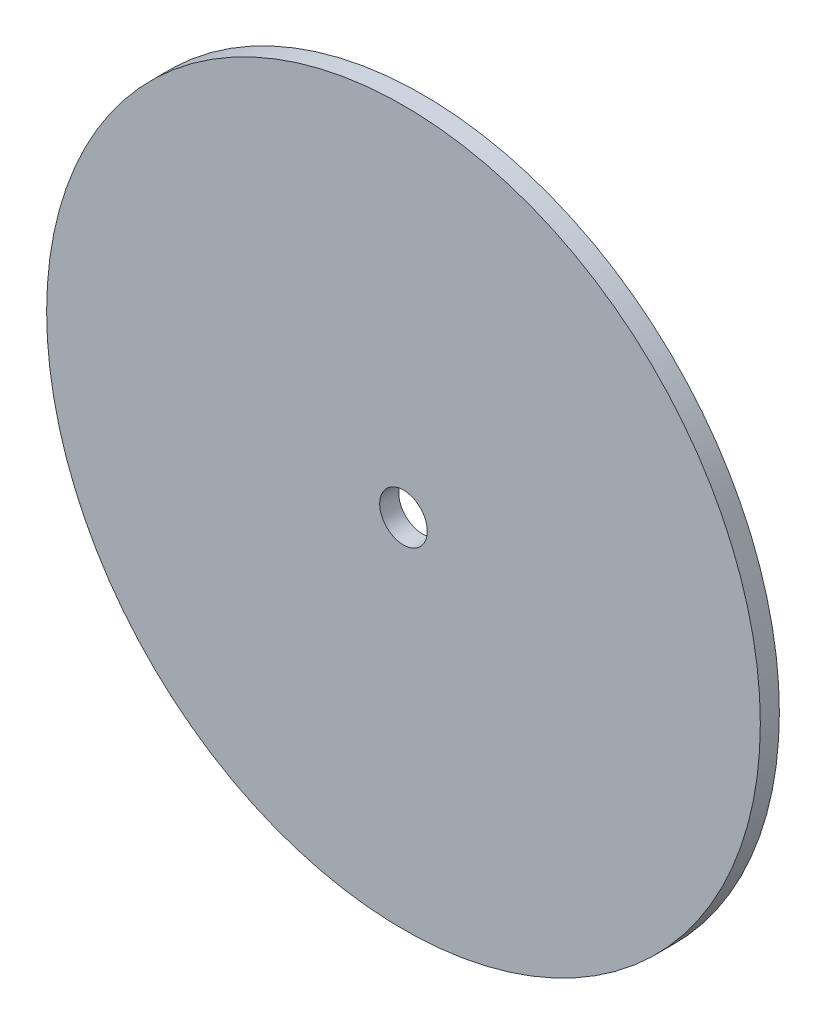
ISO-10303-21;
HEADER;
FILE_DESCRIPTION(('STEP AP214'),'2;1');
FILE_NAME('part.step','',(''),(''),'','','');
FILE_SCHEMA(('AUTOMOTIVE_DESIGN { 1 0 10303 214 1 1 1 1 }'));
ENDSEC;
DATA;
#1=APPLICATION_CONTEXT('core data for automotive mechanical design processes');
#2=APPLICATION_PROTOCOL_DEFINITION('international standard','automotive_design',2000,#1);
#3=PRODUCT_CONTEXT('',#1,'mechanical');
#4=PRODUCT('Part','Part','',(#3));
#5=PRODUCT_RELATED_PRODUCT_CATEGORY('part','',(#4));
#6=PRODUCT_DEFINITION_FORMATION('','',#4);
#7=PRODUCT_DEFINITION_CONTEXT('part definition',#1,'design');
#8=PRODUCT_DEFINITION('design','',#6,#7);
#9=PRODUCT_DEFINITION_SHAPE('','',#8);
#10=(LENGTH_UNIT() NAMED_UNIT(*) SI_UNIT(.MILLI.,.METRE.));
#11=(NAMED_UNIT(*) PLANE_ANGLE_UNIT() SI_UNIT($,.RADIAN.));
#12=(NAMED_UNIT(*) SI_UNIT($,.STERADIAN.) SOLID_ANGLE_UNIT());
#13=UNCERTAINTY_MEASURE_WITH_UNIT(LENGTH_MEASURE(1.E-05),#10,'distance_accuracy_value','');
#14=(GEOMETRIC_REPRESENTATION_CONTEXT(3) GLOBAL_UNCERTAINTY_ASSIGNED_CONTEXT((#13)) GLOBAL_UNIT_ASSIGNED_CONTEXT((#10,
#11,#12)) REPRESENTATION_CONTEXT('',''));
#15=CARTESIAN_POINT('',(0.,0.,0.));
#16=DIRECTION('',(0.,0.,1.));
#17=DIRECTION('',(1.,0.,0.));
#18=AXIS2_PLACEMENT_3D('',#15,#16,#17);
#19=CARTESIAN_POINT('',(0.,0.,-2.));
#20=DIRECTION('',(0.,0.,1.));
#21=DIRECTION('',(1.,0.,0.));
#22=AXIS2_PLACEMENT_3D('',#19,#20,#21);
#23=CYLINDRICAL_SURFACE('',#22,37.5);
#24=CARTESIAN_POINT('',(0.,0.,-2.));
#25=DIRECTION('',(0.,0.,1.));
#26=DIRECTION('',(1.,0.,0.));
#27=AXIS2_PLACEMENT_3D('',#24,#25,#26);
#28=CIRCLE('',#27,37.5);
#29=CARTESIAN_POINT('',(37.5,0.,-2.));
#30=VERTEX_POINT('',#29);
#31=EDGE_CURVE('E10',#30,#30,#28,.T.);
#32=ORIENTED_EDGE('',*,*,#31,.T.);
#33=EDGE_LOOP('',(#32));
#34=FACE_BOUND('',#33,.T.);
#35=CARTESIAN_POINT('',(0.,0.,0.));
#36=DIRECTION('',(0.,0.,1.));
#37=DIRECTION('',(1.,0.,0.));
#38=AXIS2_PLACEMENT_3D('',#35,#36,#37);
#39=CIRCLE('',#38,37.5);
#40=CARTESIAN_POINT('',(37.5,0.,0.));
#41=VERTEX_POINT('',#40);
#42=EDGE_CURVE('E38',#41,#41,#39,.T.);
#43=ORIENTED_EDGE('',*,*,#42,.F.);
#44=EDGE_LOOP('',(#43));
#45=FACE_BOUND('',#44,.T.);
#46=ADVANCED_FACE('F35',(#34,#45),#23,.T.);
#47=CARTESIAN_POINT('',(0.,0.,-2.));
#48=DIRECTION('',(0.,0.,1.));
#49=DIRECTION('',(1.,0.,0.));
#50=AXIS2_PLACEMENT_3D('',#47,#48,#49);
#51=PLANE('',#50);
#52=CARTESIAN_POINT('',(0.,0.,-2.));
#53=DIRECTION('',(0.,0.,1.));
#54=DIRECTION('',(1.,0.,0.));
#55=AXIS2_PLACEMENT_3D('',#52,#53,#54);
#56=CIRCLE('',#55,2.5);
#57=CARTESIAN_POINT('',(2.5,0.,-2.));
#58=VERTEX_POINT('',#57);
#59=EDGE_CURVE('E45',#58,#58,#56,.T.);
#60=ORIENTED_EDGE('',*,*,#59,.T.);
#61=EDGE_LOOP('',(#60));
#62=FACE_BOUND('',#61,.T.);
#63=ORIENTED_EDGE('',*,*,#31,.F.);
#64=EDGE_LOOP('',(#63));
#65=FACE_BOUND('',#64,.T.);
#66=ADVANCED_FACE('F59',(#62,#65),#51,.F.);
#67=CARTESIAN_POINT('',(0.,0.,0.));
#68=DIRECTION('',(0.,0.,1.));
#69=DIRECTION('',(1.,0.,0.));
#70=AXIS2_PLACEMENT_3D('',#67,#68,#69);
#71=PLANE('',#70);
#72=CARTESIAN_POINT('',(0.,0.,0.));
#73=DIRECTION('',(0.,0.,1.));
#74=DIRECTION('',(1.,0.,0.));
#75=AXIS2_PLACEMENT_3D('',#72,#73,#74);
#76=CIRCLE('',#75,2.5);
#77=CARTESIAN_POINT('',(2.5,0.,0.));
#78=VERTEX_POINT('',#77);
#79=EDGE_CURVE('E49',#78,#78,#76,.T.);
#80=ORIENTED_EDGE('',*,*,#79,.F.);
#81=EDGE_LOOP('',(#80));
#82=FACE_BOUND('',#81,.T.);
#83=ORIENTED_EDGE('',*,*,#42,.T.);
#84=EDGE_LOOP('',(#83));
#85=FACE_BOUND('',#84,.T.);
#86=ADVANCED_FACE('F56',(#82,#85),#71,.T.);
#87=CARTESIAN_POINT('',(0.,0.,-10.));
#88=DIRECTION('',(0.,0.,1.));
#89=DIRECTION('',(1.,0.,0.));
#90=AXIS2_PLACEMENT_3D('',#87,#88,#89);
#91=CYLINDRICAL_SURFACE('',#90,2.5);
#92=ORIENTED_EDGE('',*,*,#79,.T.);
#93=EDGE_LOOP('',(#92));
#94=FACE_BOUND('',#93,.T.);
#95=ORIENTED_EDGE('',*,*,#59,.F.);
#96=EDGE_LOOP('',(#95));
#97=FACE_BOUND('',#96,.T.);
#98=ADVANCED_FACE('F53',(#94,#97),#91,.F.);
#99=CLOSED_SHELL('',(#46,#66,#86,#98));
#100=MANIFOLD_SOLID_BREP('B2',#99);
#101=ADVANCED_BREP_SHAPE_REPRESENTATION('',(#18,#100),#14);
#102=SHAPE_DEFINITION_REPRESENTATION(#9,#101);
ENDSEC;
END-ISO-10303-21;
